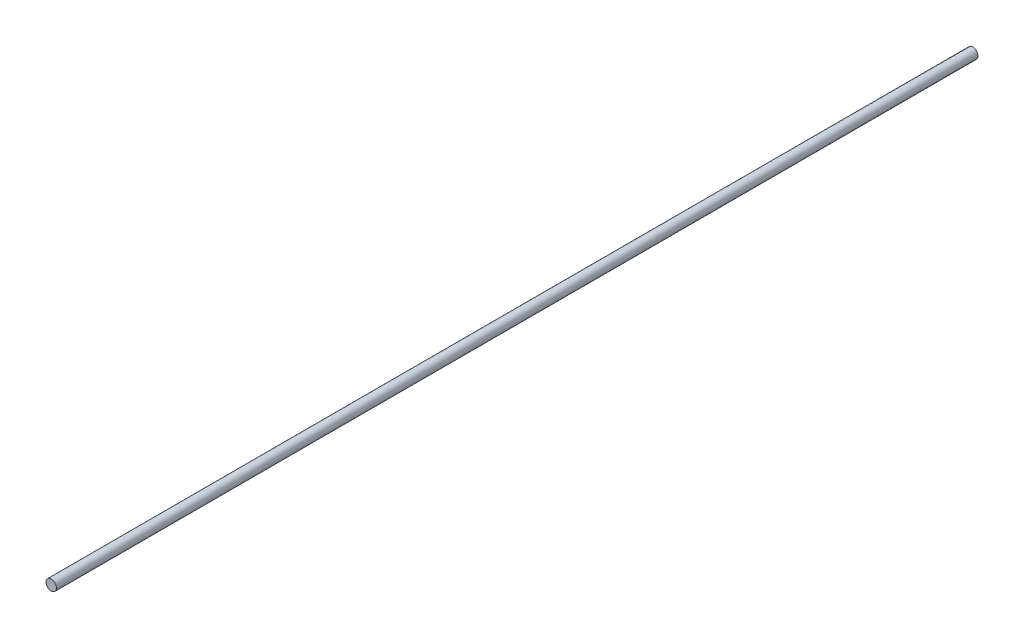
ISO-10303-21;
HEADER;
FILE_DESCRIPTION(('STEP AP214'),'2;1');
FILE_NAME('part.step','',(''),(''),'','','');
FILE_SCHEMA(('AUTOMOTIVE_DESIGN { 1 0 10303 214 1 1 1 1 }'));
ENDSEC;
DATA;
#1=APPLICATION_CONTEXT('core data for automotive mechanical design processes');
#2=APPLICATION_PROTOCOL_DEFINITION('international standard','automotive_design',2000,#1);
#3=PRODUCT_CONTEXT('',#1,'mechanical');
#4=PRODUCT('Part','Part','',(#3));
#5=PRODUCT_RELATED_PRODUCT_CATEGORY('part','',(#4));
#6=PRODUCT_DEFINITION_FORMATION('','',#4);
#7=PRODUCT_DEFINITION_CONTEXT('part definition',#1,'design');
#8=PRODUCT_DEFINITION('design','',#6,#7);
#9=PRODUCT_DEFINITION_SHAPE('','',#8);
#10=(LENGTH_UNIT() NAMED_UNIT(*) SI_UNIT(.MILLI.,.METRE.));
#11=(NAMED_UNIT(*) PLANE_ANGLE_UNIT() SI_UNIT($,.RADIAN.));
#12=(NAMED_UNIT(*) SI_UNIT($,.STERADIAN.) SOLID_ANGLE_UNIT());
#13=UNCERTAINTY_MEASURE_WITH_UNIT(LENGTH_MEASURE(1.E-05),#10,'distance_accuracy_value','');
#14=(GEOMETRIC_REPRESENTATION_CONTEXT(3) GLOBAL_UNCERTAINTY_ASSIGNED_CONTEXT((#13)) GLOBAL_UNIT_ASSIGNED_CONTEXT((#10,
#11,#12)) REPRESENTATION_CONTEXT('',''));
#15=CARTESIAN_POINT('',(0.,0.,0.));
#16=DIRECTION('',(0.,0.,1.));
#17=DIRECTION('',(1.,0.,0.));
#18=AXIS2_PLACEMENT_3D('',#15,#16,#17);
#19=CARTESIAN_POINT('',(0.,0.,1121.918));
#20=DIRECTION('',(0.,0.,-1.));
#21=DIRECTION('',(-1.,0.,0.));
#22=AXIS2_PLACEMENT_3D('',#19,#20,#21);
#23=CYLINDRICAL_SURFACE('',#22,6.35);
#24=CARTESIAN_POINT('',(0.,0.,1121.918));
#25=DIRECTION('',(0.,0.,1.));
#26=DIRECTION('',(1.,0.,0.));
#27=AXIS2_PLACEMENT_3D('',#24,#25,#26);
#28=CIRCLE('',#27,6.35);
#29=CARTESIAN_POINT('',(6.35,0.,1121.918));
#30=VERTEX_POINT('',#29);
#31=EDGE_CURVE('E11',#30,#30,#28,.T.);
#32=ORIENTED_EDGE('',*,*,#31,.F.);
#33=EDGE_LOOP('',(#32));
#34=FACE_BOUND('',#33,.T.);
#35=CARTESIAN_POINT('',(0.,0.,0.));
#36=DIRECTION('',(0.,0.,1.));
#37=DIRECTION('',(1.,0.,0.));
#38=AXIS2_PLACEMENT_3D('',#35,#36,#37);
#39=CIRCLE('',#38,6.35);
#40=CARTESIAN_POINT('',(6.35,0.,0.));
#41=VERTEX_POINT('',#40);
#42=EDGE_CURVE('E49',#41,#41,#39,.T.);
#43=ORIENTED_EDGE('',*,*,#42,.T.);
#44=EDGE_LOOP('',(#43));
#45=FACE_BOUND('',#44,.T.);
#46=ADVANCED_FACE('F46',(#34,#45),#23,.T.);
#47=CARTESIAN_POINT('',(0.,0.,1121.918));
#48=DIRECTION('',(0.,0.,1.));
#49=DIRECTION('',(1.,0.,0.));
#50=AXIS2_PLACEMENT_3D('',#47,#48,#49);
#51=PLANE('',#50);
#52=ORIENTED_EDGE('',*,*,#31,.T.);
#53=EDGE_LOOP('',(#52));
#54=FACE_BOUND('',#53,.T.);
#55=ADVANCED_FACE('F64',(#54),#51,.T.);
#56=CARTESIAN_POINT('',(0.,0.,0.));
#57=DIRECTION('',(0.,0.,1.));
#58=DIRECTION('',(1.,0.,0.));
#59=AXIS2_PLACEMENT_3D('',#56,#57,#58);
#60=PLANE('',#59);
#61=ORIENTED_EDGE('',*,*,#42,.F.);
#62=EDGE_LOOP('',(#61));
#63=FACE_BOUND('',#62,.T.);
#64=ADVANCED_FACE('F62',(#63),#60,.F.);
#65=CLOSED_SHELL('',(#46,#55,#64));
#66=MANIFOLD_SOLID_BREP('B2',#65);
#67=ADVANCED_BREP_SHAPE_REPRESENTATION('',(#18,#66),#14);
#68=SHAPE_DEFINITION_REPRESENTATION(#9,#67);
ENDSEC;
END-ISO-10303-21;
